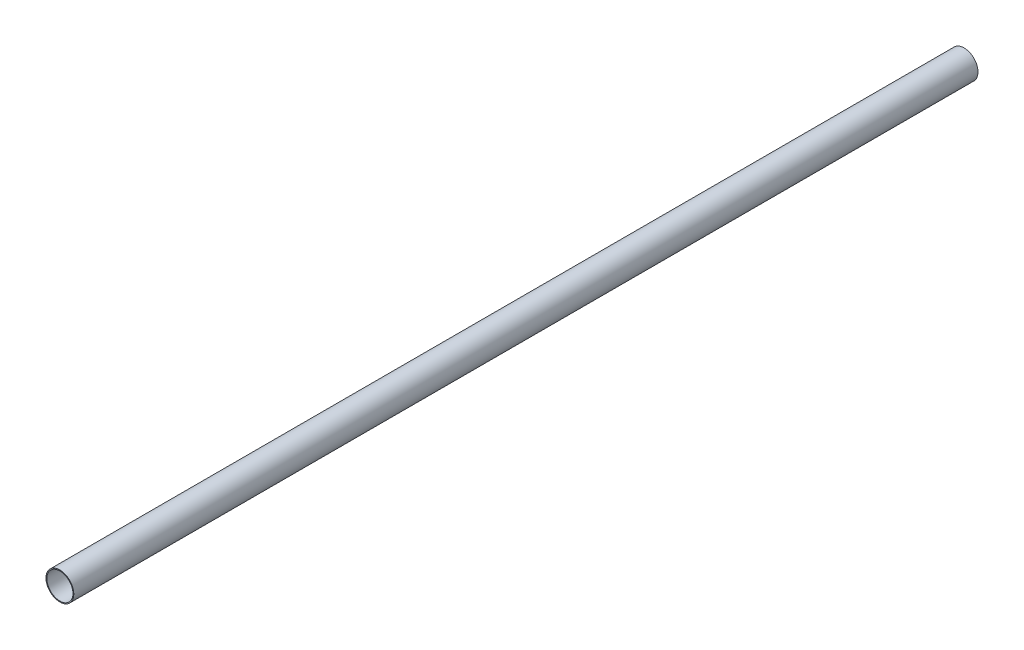
ISO-10303-21;
HEADER;
FILE_DESCRIPTION(('STEP AP214'),'2;1');
FILE_NAME('part.step','',(''),(''),'','','');
FILE_SCHEMA(('AUTOMOTIVE_DESIGN { 1 0 10303 214 1 1 1 1 }'));
ENDSEC;
DATA;
#1=APPLICATION_CONTEXT('core data for automotive mechanical design processes');
#2=APPLICATION_PROTOCOL_DEFINITION('international standard','automotive_design',2000,#1);
#3=PRODUCT_CONTEXT('',#1,'mechanical');
#4=PRODUCT('Part','Part','',(#3));
#5=PRODUCT_RELATED_PRODUCT_CATEGORY('part','',(#4));
#6=PRODUCT_DEFINITION_FORMATION('','',#4);
#7=PRODUCT_DEFINITION_CONTEXT('part definition',#1,'design');
#8=PRODUCT_DEFINITION('design','',#6,#7);
#9=PRODUCT_DEFINITION_SHAPE('','',#8);
#10=(LENGTH_UNIT() NAMED_UNIT(*) SI_UNIT(.MILLI.,.METRE.));
#11=(NAMED_UNIT(*) PLANE_ANGLE_UNIT() SI_UNIT($,.RADIAN.));
#12=(NAMED_UNIT(*) SI_UNIT($,.STERADIAN.) SOLID_ANGLE_UNIT());
#13=UNCERTAINTY_MEASURE_WITH_UNIT(LENGTH_MEASURE(1.E-05),#10,'distance_accuracy_value','');
#14=(GEOMETRIC_REPRESENTATION_CONTEXT(3) GLOBAL_UNCERTAINTY_ASSIGNED_CONTEXT((#13)) GLOBAL_UNIT_ASSIGNED_CONTEXT((#10,
#11,#12)) REPRESENTATION_CONTEXT('',''));
#15=CARTESIAN_POINT('',(0.,0.,0.));
#16=DIRECTION('',(0.,0.,1.));
#17=DIRECTION('',(1.,0.,0.));
#18=AXIS2_PLACEMENT_3D('',#15,#16,#17);
#19=CARTESIAN_POINT('',(0.,0.,0.));
#20=DIRECTION('',(0.,0.,-1.));
#21=DIRECTION('',(-1.,0.,0.));
#22=AXIS2_PLACEMENT_3D('',#19,#20,#21);
#23=CYLINDRICAL_SURFACE('',#22,4.);
#24=CARTESIAN_POINT('',(0.,0.,-260.));
#25=DIRECTION('',(0.,0.,1.));
#26=DIRECTION('',(1.,0.,0.));
#27=AXIS2_PLACEMENT_3D('',#24,#25,#26);
#28=CIRCLE('',#27,4.);
#29=CARTESIAN_POINT('',(4.,0.,-260.));
#30=VERTEX_POINT('',#29);
#31=EDGE_CURVE('E46',#30,#30,#28,.T.);
#32=ORIENTED_EDGE('',*,*,#31,.T.);
#33=EDGE_LOOP('',(#32));
#34=FACE_BOUND('',#33,.T.);
#35=CARTESIAN_POINT('',(0.,0.,0.));
#36=DIRECTION('',(0.,0.,1.));
#37=DIRECTION('',(1.,0.,0.));
#38=AXIS2_PLACEMENT_3D('',#35,#36,#37);
#39=CIRCLE('',#38,4.);
#40=CARTESIAN_POINT('',(4.,0.,0.));
#41=VERTEX_POINT('',#40);
#42=EDGE_CURVE('E37',#41,#41,#39,.T.);
#43=ORIENTED_EDGE('',*,*,#42,.F.);
#44=EDGE_LOOP('',(#43));
#45=FACE_BOUND('',#44,.T.);
#46=ADVANCED_FACE('F34',(#34,#45),#23,.T.);
#47=CARTESIAN_POINT('',(0.,0.,0.));
#48=DIRECTION('',(0.,0.,1.));
#49=DIRECTION('',(1.,0.,0.));
#50=AXIS2_PLACEMENT_3D('',#47,#48,#49);
#51=PLANE('',#50);
#52=CARTESIAN_POINT('',(0.,0.,0.));
#53=DIRECTION('',(0.,0.,1.));
#54=DIRECTION('',(1.,0.,0.));
#55=AXIS2_PLACEMENT_3D('',#52,#53,#54);
#56=CIRCLE('',#55,3.75);
#57=CARTESIAN_POINT('',(3.75,0.,0.));
#58=VERTEX_POINT('',#57);
#59=EDGE_CURVE('E41',#58,#58,#56,.F.);
#60=ORIENTED_EDGE('',*,*,#59,.T.);
#61=EDGE_LOOP('',(#60));
#62=FACE_BOUND('',#61,.T.);
#63=ORIENTED_EDGE('',*,*,#42,.T.);
#64=EDGE_LOOP('',(#63));
#65=FACE_BOUND('',#64,.T.);
#66=ADVANCED_FACE('F54',(#62,#65),#51,.T.);
#67=CARTESIAN_POINT('',(0.,0.,-260.));
#68=DIRECTION('',(0.,0.,1.));
#69=DIRECTION('',(1.,0.,0.));
#70=AXIS2_PLACEMENT_3D('',#67,#68,#69);
#71=PLANE('',#70);
#72=CARTESIAN_POINT('',(0.,0.,-260.));
#73=DIRECTION('',(0.,0.,1.));
#74=DIRECTION('',(1.,0.,0.));
#75=AXIS2_PLACEMENT_3D('',#72,#73,#74);
#76=CIRCLE('',#75,3.75);
#77=CARTESIAN_POINT('',(3.75,0.,-260.));
#78=VERTEX_POINT('',#77);
#79=EDGE_CURVE('E10',#78,#78,#76,.F.);
#80=ORIENTED_EDGE('',*,*,#79,.F.);
#81=EDGE_LOOP('',(#80));
#82=FACE_BOUND('',#81,.T.);
#83=ORIENTED_EDGE('',*,*,#31,.F.);
#84=EDGE_LOOP('',(#83));
#85=FACE_BOUND('',#84,.T.);
#86=ADVANCED_FACE('F60',(#82,#85),#71,.F.);
#87=CARTESIAN_POINT('',(0.,0.,0.));
#88=DIRECTION('',(0.,0.,-1.));
#89=DIRECTION('',(-1.,0.,0.));
#90=AXIS2_PLACEMENT_3D('',#87,#88,#89);
#91=CYLINDRICAL_SURFACE('',#90,3.75);
#92=ORIENTED_EDGE('',*,*,#79,.T.);
#93=EDGE_LOOP('',(#92));
#94=FACE_BOUND('',#93,.T.);
#95=ORIENTED_EDGE('',*,*,#59,.F.);
#96=EDGE_LOOP('',(#95));
#97=FACE_BOUND('',#96,.T.);
#98=ADVANCED_FACE('F62',(#94,#97),#91,.F.);
#99=CLOSED_SHELL('',(#46,#66,#86,#98));
#100=MANIFOLD_SOLID_BREP('B2',#99);
#101=ADVANCED_BREP_SHAPE_REPRESENTATION('',(#18,#100),#14);
#102=SHAPE_DEFINITION_REPRESENTATION(#9,#101);
ENDSEC;
END-ISO-10303-21;
